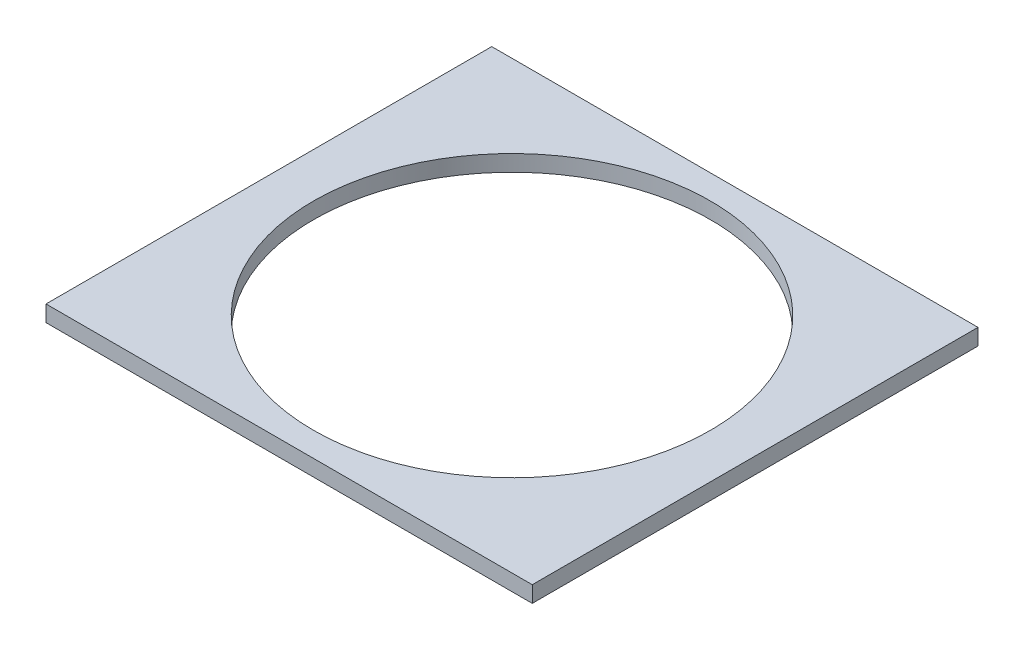
ISO-10303-21;
HEADER;
FILE_DESCRIPTION(('STEP AP214'),'2;1');
FILE_NAME('part.step','',(''),(''),'','','');
FILE_SCHEMA(('AUTOMOTIVE_DESIGN { 1 0 10303 214 1 1 1 1 }'));
ENDSEC;
DATA;
#1=APPLICATION_CONTEXT('core data for automotive mechanical design processes');
#2=APPLICATION_PROTOCOL_DEFINITION('international standard','automotive_design',2000,#1);
#3=PRODUCT_CONTEXT('',#1,'mechanical');
#4=PRODUCT('Part','Part','',(#3));
#5=PRODUCT_RELATED_PRODUCT_CATEGORY('part','',(#4));
#6=PRODUCT_DEFINITION_FORMATION('','',#4);
#7=PRODUCT_DEFINITION_CONTEXT('part definition',#1,'design');
#8=PRODUCT_DEFINITION('design','',#6,#7);
#9=PRODUCT_DEFINITION_SHAPE('','',#8);
#10=(LENGTH_UNIT() NAMED_UNIT(*) SI_UNIT(.MILLI.,.METRE.));
#11=(NAMED_UNIT(*) PLANE_ANGLE_UNIT() SI_UNIT($,.RADIAN.));
#12=(NAMED_UNIT(*) SI_UNIT($,.STERADIAN.) SOLID_ANGLE_UNIT());
#13=UNCERTAINTY_MEASURE_WITH_UNIT(LENGTH_MEASURE(1.E-05),#10,'distance_accuracy_value','');
#14=(GEOMETRIC_REPRESENTATION_CONTEXT(3) GLOBAL_UNCERTAINTY_ASSIGNED_CONTEXT((#13)) GLOBAL_UNIT_ASSIGNED_CONTEXT((#10,
#11,#12)) REPRESENTATION_CONTEXT('',''));
#15=CARTESIAN_POINT('',(0.,0.,0.));
#16=DIRECTION('',(0.,0.,1.));
#17=DIRECTION('',(1.,0.,0.));
#18=AXIS2_PLACEMENT_3D('',#15,#16,#17);
#19=CARTESIAN_POINT('',(0.,2.,0.));
#20=DIRECTION('',(1.,0.,0.));
#21=DIRECTION('',(0.,0.,-1.));
#22=AXIS2_PLACEMENT_3D('',#19,#20,#21);
#23=PLANE('',#22);
#24=DIRECTION('',(0.,0.,1.));
#25=VECTOR('',#24,1.);
#26=CARTESIAN_POINT('',(0.,0.,0.));
#27=LINE('',#26,#25);
#28=CARTESIAN_POINT('',(0.,0.,0.));
#29=VERTEX_POINT('',#28);
#30=CARTESIAN_POINT('',(0.,0.,55.));
#31=VERTEX_POINT('',#30);
#32=EDGE_CURVE('E111',#29,#31,#27,.T.);
#33=ORIENTED_EDGE('',*,*,#32,.T.);
#34=DIRECTION('',(0.,-1.,0.));
#35=VECTOR('',#34,1.);
#36=CARTESIAN_POINT('',(0.,2.,55.));
#37=LINE('',#36,#35);
#38=CARTESIAN_POINT('',(0.,2.,55.));
#39=VERTEX_POINT('',#38);
#40=EDGE_CURVE('E11',#39,#31,#37,.T.);
#41=ORIENTED_EDGE('',*,*,#40,.F.);
#42=DIRECTION('',(0.,0.,1.));
#43=VECTOR('',#42,1.);
#44=CARTESIAN_POINT('',(0.,2.,0.));
#45=LINE('',#44,#43);
#46=CARTESIAN_POINT('',(0.,2.,0.));
#47=VERTEX_POINT('',#46);
#48=EDGE_CURVE('E95',#47,#39,#45,.T.);
#49=ORIENTED_EDGE('',*,*,#48,.F.);
#50=DIRECTION('',(0.,-1.,0.));
#51=VECTOR('',#50,1.);
#52=CARTESIAN_POINT('',(0.,2.,0.));
#53=LINE('',#52,#51);
#54=EDGE_CURVE('E107',#47,#29,#53,.T.);
#55=ORIENTED_EDGE('',*,*,#54,.T.);
#56=EDGE_LOOP('',(#33,#41,#49,#55));
#57=FACE_BOUND('',#56,.T.);
#58=ADVANCED_FACE('F43',(#57),#23,.F.);
#59=CARTESIAN_POINT('',(0.,2.,55.));
#60=DIRECTION('',(0.,0.,-1.));
#61=DIRECTION('',(-1.,0.,0.));
#62=AXIS2_PLACEMENT_3D('',#59,#60,#61);
#63=PLANE('',#62);
#64=DIRECTION('',(1.,0.,0.));
#65=VECTOR('',#64,1.);
#66=CARTESIAN_POINT('',(0.,0.,55.));
#67=LINE('',#66,#65);
#68=CARTESIAN_POINT('',(60.,0.,55.));
#69=VERTEX_POINT('',#68);
#70=EDGE_CURVE('E100',#31,#69,#67,.T.);
#71=ORIENTED_EDGE('',*,*,#70,.T.);
#72=DIRECTION('',(0.,-1.,0.));
#73=VECTOR('',#72,1.);
#74=CARTESIAN_POINT('',(60.,2.,55.));
#75=LINE('',#74,#73);
#76=CARTESIAN_POINT('',(60.,2.,55.));
#77=VERTEX_POINT('',#76);
#78=EDGE_CURVE('E52',#77,#69,#75,.T.);
#79=ORIENTED_EDGE('',*,*,#78,.F.);
#80=DIRECTION('',(1.,0.,0.));
#81=VECTOR('',#80,1.);
#82=CARTESIAN_POINT('',(0.,2.,55.));
#83=LINE('',#82,#81);
#84=EDGE_CURVE('E90',#39,#77,#83,.T.);
#85=ORIENTED_EDGE('',*,*,#84,.F.);
#86=ORIENTED_EDGE('',*,*,#40,.T.);
#87=EDGE_LOOP('',(#71,#79,#85,#86));
#88=FACE_BOUND('',#87,.T.);
#89=ADVANCED_FACE('F99',(#88),#63,.F.);
#90=CARTESIAN_POINT('',(60.,2.,0.));
#91=DIRECTION('',(-1.,0.,0.));
#92=DIRECTION('',(0.,0.,1.));
#93=AXIS2_PLACEMENT_3D('',#90,#91,#92);
#94=PLANE('',#93);
#95=DIRECTION('',(0.,0.,-1.));
#96=VECTOR('',#95,1.);
#97=CARTESIAN_POINT('',(60.,0.,0.));
#98=LINE('',#97,#96);
#99=CARTESIAN_POINT('',(60.,0.,0.));
#100=VERTEX_POINT('',#99);
#101=EDGE_CURVE('E77',#69,#100,#98,.T.);
#102=ORIENTED_EDGE('',*,*,#101,.T.);
#103=DIRECTION('',(0.,-1.,0.));
#104=VECTOR('',#103,1.);
#105=CARTESIAN_POINT('',(60.,2.,0.));
#106=LINE('',#105,#104);
#107=CARTESIAN_POINT('',(60.,2.,0.));
#108=VERTEX_POINT('',#107);
#109=EDGE_CURVE('E102',#108,#100,#106,.T.);
#110=ORIENTED_EDGE('',*,*,#109,.F.);
#111=DIRECTION('',(0.,0.,-1.));
#112=VECTOR('',#111,1.);
#113=CARTESIAN_POINT('',(60.,2.,0.));
#114=LINE('',#113,#112);
#115=EDGE_CURVE('E93',#77,#108,#114,.T.);
#116=ORIENTED_EDGE('',*,*,#115,.F.);
#117=ORIENTED_EDGE('',*,*,#78,.T.);
#118=EDGE_LOOP('',(#102,#110,#116,#117));
#119=FACE_BOUND('',#118,.T.);
#120=ADVANCED_FACE('F103',(#119),#94,.F.);
#121=CARTESIAN_POINT('',(0.,2.,0.));
#122=DIRECTION('',(0.,0.,1.));
#123=DIRECTION('',(1.,0.,0.));
#124=AXIS2_PLACEMENT_3D('',#121,#122,#123);
#125=PLANE('',#124);
#126=DIRECTION('',(-1.,0.,0.));
#127=VECTOR('',#126,1.);
#128=CARTESIAN_POINT('',(0.,0.,0.));
#129=LINE('',#128,#127);
#130=EDGE_CURVE('E83',#100,#29,#129,.T.);
#131=ORIENTED_EDGE('',*,*,#130,.T.);
#132=ORIENTED_EDGE('',*,*,#54,.F.);
#133=DIRECTION('',(-1.,0.,0.));
#134=VECTOR('',#133,1.);
#135=CARTESIAN_POINT('',(0.,2.,0.));
#136=LINE('',#135,#134);
#137=EDGE_CURVE('E60',#108,#47,#136,.T.);
#138=ORIENTED_EDGE('',*,*,#137,.F.);
#139=ORIENTED_EDGE('',*,*,#109,.T.);
#140=EDGE_LOOP('',(#131,#132,#138,#139));
#141=FACE_BOUND('',#140,.T.);
#142=ADVANCED_FACE('F126',(#141),#125,.F.);
#143=CARTESIAN_POINT('',(0.,2.,0.));
#144=DIRECTION('',(0.,1.,0.));
#145=DIRECTION('',(0.,0.,1.));
#146=AXIS2_PLACEMENT_3D('',#143,#144,#145);
#147=PLANE('',#146);
#148=CARTESIAN_POINT('',(30.,2.,27.5));
#149=DIRECTION('',(0.,1.,0.));
#150=DIRECTION('',(0.,0.,1.));
#151=AXIS2_PLACEMENT_3D('',#148,#149,#150);
#152=CIRCLE('',#151,24.5);
#153=CARTESIAN_POINT('',(30.,2.,52.));
#154=VERTEX_POINT('',#153);
#155=EDGE_CURVE('E134',#154,#154,#152,.T.);
#156=ORIENTED_EDGE('',*,*,#155,.F.);
#157=EDGE_LOOP('',(#156));
#158=FACE_BOUND('',#157,.T.);
#159=ORIENTED_EDGE('',*,*,#48,.T.);
#160=ORIENTED_EDGE('',*,*,#84,.T.);
#161=ORIENTED_EDGE('',*,*,#115,.T.);
#162=ORIENTED_EDGE('',*,*,#137,.T.);
#163=EDGE_LOOP('',(#159,#160,#161,#162));
#164=FACE_BOUND('',#163,.T.);
#165=ADVANCED_FACE('F91',(#158,#164),#147,.T.);
#166=CARTESIAN_POINT('',(0.,0.,0.));
#167=DIRECTION('',(0.,1.,0.));
#168=DIRECTION('',(0.,0.,1.));
#169=AXIS2_PLACEMENT_3D('',#166,#167,#168);
#170=PLANE('',#169);
#171=CARTESIAN_POINT('',(30.,0.,27.5));
#172=DIRECTION('',(0.,1.,0.));
#173=DIRECTION('',(0.,0.,1.));
#174=AXIS2_PLACEMENT_3D('',#171,#172,#173);
#175=CIRCLE('',#174,24.5);
#176=CARTESIAN_POINT('',(30.,0.,52.));
#177=VERTEX_POINT('',#176);
#178=EDGE_CURVE('E115',#177,#177,#175,.T.);
#179=ORIENTED_EDGE('',*,*,#178,.T.);
#180=EDGE_LOOP('',(#179));
#181=FACE_BOUND('',#180,.T.);
#182=ORIENTED_EDGE('',*,*,#32,.F.);
#183=ORIENTED_EDGE('',*,*,#130,.F.);
#184=ORIENTED_EDGE('',*,*,#101,.F.);
#185=ORIENTED_EDGE('',*,*,#70,.F.);
#186=EDGE_LOOP('',(#182,#183,#184,#185));
#187=FACE_BOUND('',#186,.T.);
#188=ADVANCED_FACE('F129',(#181,#187),#170,.F.);
#189=CARTESIAN_POINT('',(30.,0.,27.5));
#190=DIRECTION('',(0.,1.,0.));
#191=DIRECTION('',(0.,0.,1.));
#192=AXIS2_PLACEMENT_3D('',#189,#190,#191);
#193=CYLINDRICAL_SURFACE('',#192,24.5);
#194=ORIENTED_EDGE('',*,*,#178,.F.);
#195=EDGE_LOOP('',(#194));
#196=FACE_BOUND('',#195,.T.);
#197=ORIENTED_EDGE('',*,*,#155,.T.);
#198=EDGE_LOOP('',(#197));
#199=FACE_BOUND('',#198,.T.);
#200=ADVANCED_FACE('F141',(#196,#199),#193,.F.);
#201=CLOSED_SHELL('',(#58,#89,#120,#142,#165,#188,#200));
#202=MANIFOLD_SOLID_BREP('B2',#201);
#203=ADVANCED_BREP_SHAPE_REPRESENTATION('',(#18,#202),#14);
#204=SHAPE_DEFINITION_REPRESENTATION(#9,#203);
ENDSEC;
END-ISO-10303-21;
